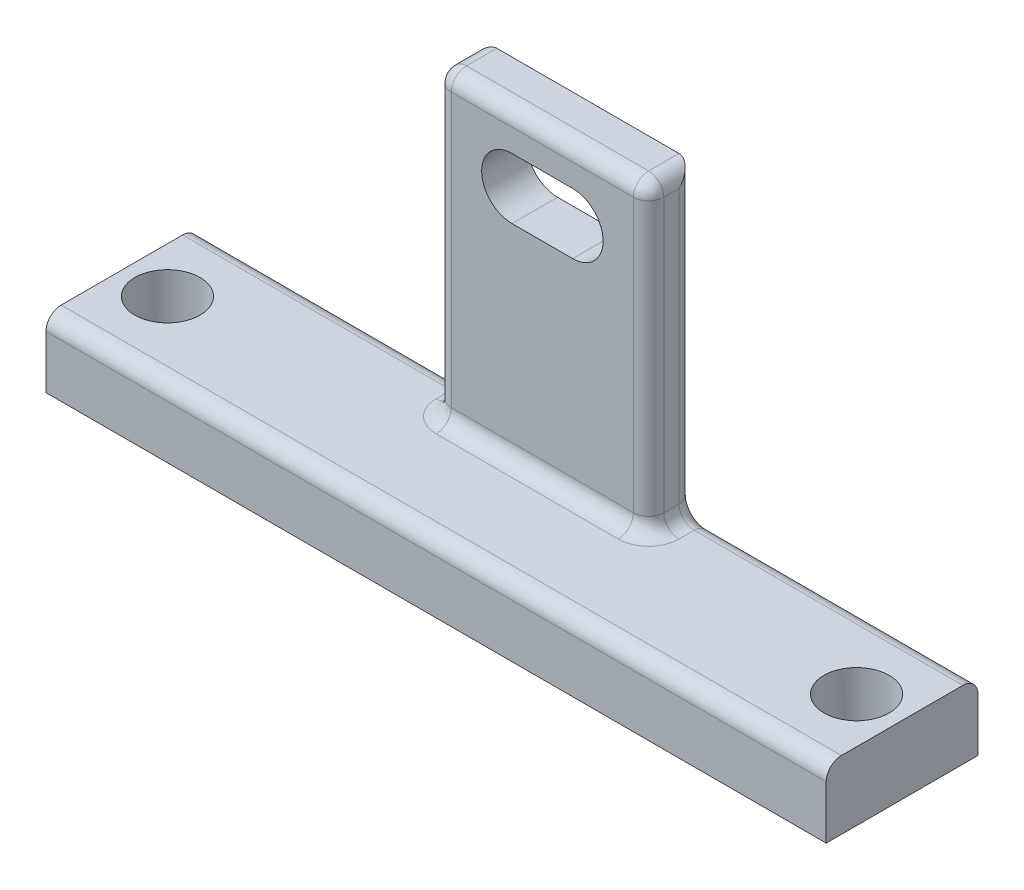
ISO-10303-21;
HEADER;
FILE_DESCRIPTION(('STEP AP214'),'2;1');
FILE_NAME('part.step','',(''),(''),'','','');
FILE_SCHEMA(('AUTOMOTIVE_DESIGN { 1 0 10303 214 1 1 1 1 }'));
ENDSEC;
DATA;
#1=APPLICATION_CONTEXT('core data for automotive mechanical design processes');
#2=APPLICATION_PROTOCOL_DEFINITION('international standard','automotive_design',2000,#1);
#3=PRODUCT_CONTEXT('',#1,'mechanical');
#4=PRODUCT('Part','Part','',(#3));
#5=PRODUCT_RELATED_PRODUCT_CATEGORY('part','',(#4));
#6=PRODUCT_DEFINITION_FORMATION('','',#4);
#7=PRODUCT_DEFINITION_CONTEXT('part definition',#1,'design');
#8=PRODUCT_DEFINITION('design','',#6,#7);
#9=PRODUCT_DEFINITION_SHAPE('','',#8);
#10=(LENGTH_UNIT() NAMED_UNIT(*) SI_UNIT(.MILLI.,.METRE.));
#11=(NAMED_UNIT(*) PLANE_ANGLE_UNIT() SI_UNIT($,.RADIAN.));
#12=(NAMED_UNIT(*) SI_UNIT($,.STERADIAN.) SOLID_ANGLE_UNIT());
#13=UNCERTAINTY_MEASURE_WITH_UNIT(LENGTH_MEASURE(1.E-05),#10,'distance_accuracy_value','');
#14=(GEOMETRIC_REPRESENTATION_CONTEXT(3) GLOBAL_UNCERTAINTY_ASSIGNED_CONTEXT((#13)) GLOBAL_UNIT_ASSIGNED_CONTEXT((#10,
#11,#12)) REPRESENTATION_CONTEXT('',''));
#15=CARTESIAN_POINT('',(0.,0.,0.));
#16=DIRECTION('',(0.,0.,1.));
#17=DIRECTION('',(1.,0.,0.));
#18=AXIS2_PLACEMENT_3D('',#15,#16,#17);
#19=CARTESIAN_POINT('',(-6.48837209302326,3.6453488372093,10.));
#20=DIRECTION('',(0.,-1.,0.));
#21=DIRECTION('',(0.,0.,-1.));
#22=AXIS2_PLACEMENT_3D('',#19,#20,#21);
#23=PLANE('',#22);
#24=CARTESIAN_POINT('',(41.9116279069767,3.6453488372093,5.));
#25=DIRECTION('',(0.,-1.,0.));
#26=DIRECTION('',(0.,0.,-1.));
#27=AXIS2_PLACEMENT_3D('',#24,#25,#26);
#28=CIRCLE('',#27,2.15);
#29=CARTESIAN_POINT('',(41.9116279069767,3.6453488372093,2.85));
#30=VERTEX_POINT('',#29);
#31=EDGE_CURVE('E272',#30,#30,#28,.T.);
#32=ORIENTED_EDGE('',*,*,#31,.T.);
#33=EDGE_LOOP('',(#32));
#34=FACE_BOUND('',#33,.T.);
#35=CARTESIAN_POINT('',(-3.48837209302326,3.6453488372093,5.));
#36=DIRECTION('',(0.,-1.,0.));
#37=DIRECTION('',(0.,0.,-1.));
#38=AXIS2_PLACEMENT_3D('',#35,#36,#37);
#39=CIRCLE('',#38,2.15);
#40=CARTESIAN_POINT('',(-3.48837209302326,3.6453488372093,2.85));
#41=VERTEX_POINT('',#40);
#42=EDGE_CURVE('E291',#41,#41,#39,.T.);
#43=ORIENTED_EDGE('',*,*,#42,.T.);
#44=EDGE_LOOP('',(#43));
#45=FACE_BOUND('',#44,.T.);
#46=DIRECTION('',(0.,0.,1.));
#47=VECTOR('',#46,1.);
#48=CARTESIAN_POINT('',(11.2116279069767,3.6453488372093,0.));
#49=LINE('',#48,#47);
#50=CARTESIAN_POINT('',(11.2116279069767,3.6453488372093,2.));
#51=VERTEX_POINT('',#50);
#52=CARTESIAN_POINT('',(11.2116279069767,3.6453488372093,0.999999999999999));
#53=VERTEX_POINT('',#52);
#54=EDGE_CURVE('E372',#51,#53,#49,.F.);
#55=ORIENTED_EDGE('',*,*,#54,.T.);
#56=DIRECTION('',(-1.,0.,0.));
#57=VECTOR('',#56,1.);
#58=CARTESIAN_POINT('',(-6.48837209302326,3.6453488372093,0.999999999999999));
#59=LINE('',#58,#57);
#60=CARTESIAN_POINT('',(-6.48837209302326,3.6453488372093,0.999999999999999));
#61=VERTEX_POINT('',#60);
#62=EDGE_CURVE('E375',#53,#61,#59,.T.);
#63=ORIENTED_EDGE('',*,*,#62,.T.);
#64=DIRECTION('',(0.,0.,-1.));
#65=VECTOR('',#64,1.);
#66=CARTESIAN_POINT('',(-6.48837209302326,3.6453488372093,10.));
#67=LINE('',#66,#65);
#68=CARTESIAN_POINT('',(-6.48837209302326,3.6453488372093,9.));
#69=VERTEX_POINT('',#68);
#70=EDGE_CURVE('E286',#69,#61,#67,.T.);
#71=ORIENTED_EDGE('',*,*,#70,.F.);
#72=DIRECTION('',(-1.,0.,0.));
#73=VECTOR('',#72,1.);
#74=CARTESIAN_POINT('',(44.9116279069767,3.6453488372093,9.));
#75=LINE('',#74,#73);
#76=CARTESIAN_POINT('',(44.9116279069767,3.6453488372093,9.));
#77=VERTEX_POINT('',#76);
#78=EDGE_CURVE('E352',#69,#77,#75,.F.);
#79=ORIENTED_EDGE('',*,*,#78,.T.);
#80=DIRECTION('',(0.,0.,-1.));
#81=VECTOR('',#80,1.);
#82=CARTESIAN_POINT('',(44.9116279069767,3.6453488372093,10.));
#83=LINE('',#82,#81);
#84=CARTESIAN_POINT('',(44.9116279069767,3.6453488372093,0.999999999999999));
#85=VERTEX_POINT('',#84);
#86=EDGE_CURVE('E300',#77,#85,#83,.T.);
#87=ORIENTED_EDGE('',*,*,#86,.T.);
#88=DIRECTION('',(-1.,0.,0.));
#89=VECTOR('',#88,1.);
#90=CARTESIAN_POINT('',(-6.48837209302326,3.6453488372093,0.999999999999999));
#91=LINE('',#90,#89);
#92=CARTESIAN_POINT('',(27.2116279069767,3.6453488372093,0.999999999999999));
#93=VERTEX_POINT('',#92);
#94=EDGE_CURVE('E355',#85,#93,#91,.T.);
#95=ORIENTED_EDGE('',*,*,#94,.T.);
#96=DIRECTION('',(0.,0.,-1.));
#97=VECTOR('',#96,1.);
#98=CARTESIAN_POINT('',(27.2116279069767,3.6453488372093,3.));
#99=LINE('',#98,#97);
#100=CARTESIAN_POINT('',(27.2116279069767,3.6453488372093,2.));
#101=VERTEX_POINT('',#100);
#102=EDGE_CURVE('E358',#93,#101,#99,.F.);
#103=ORIENTED_EDGE('',*,*,#102,.T.);
#104=CARTESIAN_POINT('',(25.2116279069767,3.6453488372093,2.));
#105=DIRECTION('',(0.,-1.,0.));
#106=DIRECTION('',(0.,0.,-1.));
#107=AXIS2_PLACEMENT_3D('',#104,#105,#106);
#108=CIRCLE('',#107,2.);
#109=CARTESIAN_POINT('',(25.2116279069767,3.6453488372093,4.));
#110=VERTEX_POINT('',#109);
#111=EDGE_CURVE('E361',#110,#101,#108,.F.);
#112=ORIENTED_EDGE('',*,*,#111,.F.);
#113=DIRECTION('',(1.,0.,0.));
#114=VECTOR('',#113,1.);
#115=CARTESIAN_POINT('',(12.2116279069767,3.6453488372093,4.));
#116=LINE('',#115,#114);
#117=CARTESIAN_POINT('',(13.2116279069767,3.6453488372093,4.));
#118=VERTEX_POINT('',#117);
#119=EDGE_CURVE('E365',#110,#118,#116,.F.);
#120=ORIENTED_EDGE('',*,*,#119,.T.);
#121=CARTESIAN_POINT('',(13.2116279069767,3.6453488372093,2.));
#122=DIRECTION('',(0.,-1.,0.));
#123=DIRECTION('',(0.,0.,-1.));
#124=AXIS2_PLACEMENT_3D('',#121,#122,#123);
#125=CIRCLE('',#124,2.);
#126=EDGE_CURVE('E368',#51,#118,#125,.F.);
#127=ORIENTED_EDGE('',*,*,#126,.F.);
#128=EDGE_LOOP('',(#55,#63,#71,#79,#87,#95,#103,#112,#120,#127));
#129=FACE_BOUND('',#128,.T.);
#130=ADVANCED_FACE('F49',(#34,#45,#129),#23,.F.);
#131=CARTESIAN_POINT('',(-6.48837209302326,3.6453488372093,10.));
#132=DIRECTION('',(1.,0.,0.));
#133=DIRECTION('',(0.,1.,0.));
#134=AXIS2_PLACEMENT_3D('',#131,#132,#133);
#135=PLANE('',#134);
#136=ORIENTED_EDGE('',*,*,#70,.T.);
#137=CARTESIAN_POINT('',(-6.48837209302326,2.6453488372093,0.999999999999999));
#138=DIRECTION('',(1.,0.,0.));
#139=DIRECTION('',(0.,1.,0.));
#140=AXIS2_PLACEMENT_3D('',#137,#138,#139);
#141=CIRCLE('',#140,1.);
#142=CARTESIAN_POINT('',(-6.48837209302326,2.6453488372093,0.));
#143=VERTEX_POINT('',#142);
#144=EDGE_CURVE('E381',#61,#143,#141,.F.);
#145=ORIENTED_EDGE('',*,*,#144,.T.);
#146=DIRECTION('',(0.,-1.,0.));
#147=VECTOR('',#146,1.);
#148=CARTESIAN_POINT('',(-6.48837209302326,3.6453488372093,0.));
#149=LINE('',#148,#147);
#150=CARTESIAN_POINT('',(-6.48837209302326,-0.854651162790699,0.));
#151=VERTEX_POINT('',#150);
#152=EDGE_CURVE('E287',#143,#151,#149,.T.);
#153=ORIENTED_EDGE('',*,*,#152,.T.);
#154=DIRECTION('',(0.,0.,-1.));
#155=VECTOR('',#154,1.);
#156=CARTESIAN_POINT('',(-6.48837209302326,-0.854651162790699,10.));
#157=LINE('',#156,#155);
#158=CARTESIAN_POINT('',(-6.48837209302326,-0.854651162790699,10.));
#159=VERTEX_POINT('',#158);
#160=EDGE_CURVE('E308',#159,#151,#157,.T.);
#161=ORIENTED_EDGE('',*,*,#160,.F.);
#162=DIRECTION('',(0.,-1.,0.));
#163=VECTOR('',#162,1.);
#164=CARTESIAN_POINT('',(-6.48837209302326,3.6453488372093,10.));
#165=LINE('',#164,#163);
#166=CARTESIAN_POINT('',(-6.48837209302326,2.6453488372093,10.));
#167=VERTEX_POINT('',#166);
#168=EDGE_CURVE('E276',#167,#159,#165,.T.);
#169=ORIENTED_EDGE('',*,*,#168,.F.);
#170=CARTESIAN_POINT('',(-6.48837209302326,2.6453488372093,9.));
#171=DIRECTION('',(1.,0.,0.));
#172=DIRECTION('',(0.,1.,0.));
#173=AXIS2_PLACEMENT_3D('',#170,#171,#172);
#174=CIRCLE('',#173,1.);
#175=EDGE_CURVE('E378',#167,#69,#174,.F.);
#176=ORIENTED_EDGE('',*,*,#175,.T.);
#177=EDGE_LOOP('',(#136,#145,#153,#161,#169,#176));
#178=FACE_BOUND('',#177,.T.);
#179=ADVANCED_FACE('F610',(#178),#135,.F.);
#180=CARTESIAN_POINT('',(-6.48837209302326,-0.854651162790699,10.));
#181=DIRECTION('',(0.,1.,0.));
#182=DIRECTION('',(0.,0.,1.));
#183=AXIS2_PLACEMENT_3D('',#180,#181,#182);
#184=PLANE('',#183);
#185=CARTESIAN_POINT('',(-3.48837209302326,-0.854651162790699,5.));
#186=DIRECTION('',(0.,1.,0.));
#187=DIRECTION('',(0.,0.,1.));
#188=AXIS2_PLACEMENT_3D('',#185,#186,#187);
#189=CIRCLE('',#188,2.15);
#190=CARTESIAN_POINT('',(-3.48837209302326,-0.854651162790699,7.15));
#191=VERTEX_POINT('',#190);
#192=EDGE_CURVE('E268',#191,#191,#189,.T.);
#193=ORIENTED_EDGE('',*,*,#192,.T.);
#194=EDGE_LOOP('',(#193));
#195=FACE_BOUND('',#194,.T.);
#196=CARTESIAN_POINT('',(41.9116279069767,-0.854651162790699,5.));
#197=DIRECTION('',(0.,1.,0.));
#198=DIRECTION('',(0.,0.,1.));
#199=AXIS2_PLACEMENT_3D('',#196,#197,#198);
#200=CIRCLE('',#199,2.15);
#201=CARTESIAN_POINT('',(41.9116279069767,-0.854651162790699,7.15));
#202=VERTEX_POINT('',#201);
#203=EDGE_CURVE('E267',#202,#202,#200,.T.);
#204=ORIENTED_EDGE('',*,*,#203,.T.);
#205=EDGE_LOOP('',(#204));
#206=FACE_BOUND('',#205,.T.);
#207=DIRECTION('',(1.,0.,0.));
#208=VECTOR('',#207,1.);
#209=CARTESIAN_POINT('',(-6.48837209302326,-0.854651162790699,0.));
#210=LINE('',#209,#208);
#211=CARTESIAN_POINT('',(44.9116279069767,-0.854651162790699,0.));
#212=VERTEX_POINT('',#211);
#213=EDGE_CURVE('E290',#151,#212,#210,.T.);
#214=ORIENTED_EDGE('',*,*,#213,.T.);
#215=DIRECTION('',(0.,0.,-1.));
#216=VECTOR('',#215,1.);
#217=CARTESIAN_POINT('',(44.9116279069767,-0.854651162790699,10.));
#218=LINE('',#217,#216);
#219=CARTESIAN_POINT('',(44.9116279069767,-0.854651162790699,10.));
#220=VERTEX_POINT('',#219);
#221=EDGE_CURVE('E304',#220,#212,#218,.T.);
#222=ORIENTED_EDGE('',*,*,#221,.F.);
#223=DIRECTION('',(1.,0.,0.));
#224=VECTOR('',#223,1.);
#225=CARTESIAN_POINT('',(-6.48837209302326,-0.854651162790699,10.));
#226=LINE('',#225,#224);
#227=EDGE_CURVE('E279',#159,#220,#226,.T.);
#228=ORIENTED_EDGE('',*,*,#227,.F.);
#229=ORIENTED_EDGE('',*,*,#160,.T.);
#230=EDGE_LOOP('',(#214,#222,#228,#229));
#231=FACE_BOUND('',#230,.T.);
#232=ADVANCED_FACE('F617',(#195,#206,#231),#184,.F.);
#233=CARTESIAN_POINT('',(44.9116279069767,3.6453488372093,10.));
#234=DIRECTION('',(-1.,0.,0.));
#235=DIRECTION('',(0.,0.,1.));
#236=AXIS2_PLACEMENT_3D('',#233,#234,#235);
#237=PLANE('',#236);
#238=DIRECTION('',(0.,1.,0.));
#239=VECTOR('',#238,1.);
#240=CARTESIAN_POINT('',(44.9116279069767,3.6453488372093,0.));
#241=LINE('',#240,#239);
#242=CARTESIAN_POINT('',(44.9116279069767,2.6453488372093,0.));
#243=VERTEX_POINT('',#242);
#244=EDGE_CURVE('E280',#212,#243,#241,.T.);
#245=ORIENTED_EDGE('',*,*,#244,.T.);
#246=CARTESIAN_POINT('',(44.9116279069767,2.6453488372093,0.999999999999999));
#247=DIRECTION('',(-1.,0.,0.));
#248=DIRECTION('',(0.,0.,1.));
#249=AXIS2_PLACEMENT_3D('',#246,#247,#248);
#250=CIRCLE('',#249,1.);
#251=EDGE_CURVE('E59',#243,#85,#250,.F.);
#252=ORIENTED_EDGE('',*,*,#251,.T.);
#253=ORIENTED_EDGE('',*,*,#86,.F.);
#254=CARTESIAN_POINT('',(44.9116279069767,2.6453488372093,9.));
#255=DIRECTION('',(-1.,0.,0.));
#256=DIRECTION('',(0.,0.,1.));
#257=AXIS2_PLACEMENT_3D('',#254,#255,#256);
#258=CIRCLE('',#257,1.);
#259=CARTESIAN_POINT('',(44.9116279069767,2.6453488372093,10.));
#260=VERTEX_POINT('',#259);
#261=EDGE_CURVE('E67',#77,#260,#258,.F.);
#262=ORIENTED_EDGE('',*,*,#261,.T.);
#263=DIRECTION('',(0.,1.,0.));
#264=VECTOR('',#263,1.);
#265=CARTESIAN_POINT('',(44.9116279069767,3.6453488372093,10.));
#266=LINE('',#265,#264);
#267=EDGE_CURVE('E283',#220,#260,#266,.T.);
#268=ORIENTED_EDGE('',*,*,#267,.F.);
#269=ORIENTED_EDGE('',*,*,#221,.T.);
#270=EDGE_LOOP('',(#245,#252,#253,#262,#268,#269));
#271=FACE_BOUND('',#270,.T.);
#272=ADVANCED_FACE('F622',(#271),#237,.F.);
#273=CARTESIAN_POINT('',(0.,0.,10.));
#274=DIRECTION('',(0.,0.,1.));
#275=DIRECTION('',(1.,0.,0.));
#276=AXIS2_PLACEMENT_3D('',#273,#274,#275);
#277=PLANE('',#276);
#278=ORIENTED_EDGE('',*,*,#267,.T.);
#279=DIRECTION('',(-1.,0.,0.));
#280=VECTOR('',#279,1.);
#281=CARTESIAN_POINT('',(-6.48837209302326,2.6453488372093,10.));
#282=LINE('',#281,#280);
#283=EDGE_CURVE('E11',#260,#167,#282,.T.);
#284=ORIENTED_EDGE('',*,*,#283,.T.);
#285=ORIENTED_EDGE('',*,*,#168,.T.);
#286=ORIENTED_EDGE('',*,*,#227,.T.);
#287=EDGE_LOOP('',(#278,#284,#285,#286));
#288=FACE_BOUND('',#287,.T.);
#289=ADVANCED_FACE('F513',(#288),#277,.T.);
#290=CARTESIAN_POINT('',(0.,0.,0.));
#291=DIRECTION('',(0.,0.,1.));
#292=DIRECTION('',(1.,0.,0.));
#293=AXIS2_PLACEMENT_3D('',#290,#291,#292);
#294=PLANE('',#293);
#295=DIRECTION('',(-1.,0.,0.));
#296=VECTOR('',#295,1.);
#297=CARTESIAN_POINT('',(0.,21.1453488372093,0.));
#298=LINE('',#297,#296);
#299=CARTESIAN_POINT('',(21.2116279069767,21.1453488372093,0.));
#300=VERTEX_POINT('',#299);
#301=CARTESIAN_POINT('',(17.2116279069767,21.1453488372093,0.));
#302=VERTEX_POINT('',#301);
#303=EDGE_CURVE('E256',#300,#302,#298,.T.);
#304=ORIENTED_EDGE('',*,*,#303,.T.);
#305=CARTESIAN_POINT('',(17.2116279069767,19.1453488372093,0.));
#306=DIRECTION('',(0.,0.,1.));
#307=DIRECTION('',(1.,0.,0.));
#308=AXIS2_PLACEMENT_3D('',#305,#306,#307);
#309=CIRCLE('',#308,2.);
#310=CARTESIAN_POINT('',(17.2116279069767,17.1453488372093,0.));
#311=VERTEX_POINT('',#310);
#312=EDGE_CURVE('E260',#302,#311,#309,.T.);
#313=ORIENTED_EDGE('',*,*,#312,.T.);
#314=DIRECTION('',(1.,0.,0.));
#315=VECTOR('',#314,1.);
#316=CARTESIAN_POINT('',(0.,17.1453488372093,0.));
#317=LINE('',#316,#315);
#318=CARTESIAN_POINT('',(21.2116279069767,17.1453488372093,0.));
#319=VERTEX_POINT('',#318);
#320=EDGE_CURVE('E247',#311,#319,#317,.T.);
#321=ORIENTED_EDGE('',*,*,#320,.T.);
#322=CARTESIAN_POINT('',(21.2116279069767,19.1453488372093,0.));
#323=DIRECTION('',(0.,0.,1.));
#324=DIRECTION('',(1.,0.,0.));
#325=AXIS2_PLACEMENT_3D('',#322,#323,#324);
#326=CIRCLE('',#325,1.99999999999999);
#327=EDGE_CURVE('E218',#319,#300,#326,.T.);
#328=ORIENTED_EDGE('',*,*,#327,.T.);
#329=EDGE_LOOP('',(#304,#313,#321,#328));
#330=FACE_BOUND('',#329,.T.);
#331=ORIENTED_EDGE('',*,*,#152,.F.);
#332=DIRECTION('',(-1.,0.,0.));
#333=VECTOR('',#332,1.);
#334=CARTESIAN_POINT('',(0.,2.6453488372093,0.));
#335=LINE('',#334,#333);
#336=CARTESIAN_POINT('',(11.2116279069767,2.6453488372093,0.));
#337=VERTEX_POINT('',#336);
#338=EDGE_CURVE('E336',#143,#337,#335,.F.);
#339=ORIENTED_EDGE('',*,*,#338,.T.);
#340=CARTESIAN_POINT('',(11.2116279069767,4.6453488372093,0.));
#341=DIRECTION('',(0.,0.,1.));
#342=DIRECTION('',(1.,0.,0.));
#343=AXIS2_PLACEMENT_3D('',#340,#341,#342);
#344=CIRCLE('',#343,2.);
#345=CARTESIAN_POINT('',(13.2116279069767,4.6453488372093,0.));
#346=VERTEX_POINT('',#345);
#347=EDGE_CURVE('E332',#346,#337,#344,.F.);
#348=ORIENTED_EDGE('',*,*,#347,.F.);
#349=DIRECTION('',(0.,-1.,0.));
#350=VECTOR('',#349,1.);
#351=CARTESIAN_POINT('',(13.2116279069767,0.,0.));
#352=LINE('',#351,#350);
#353=CARTESIAN_POINT('',(13.2116279069767,23.6453488372093,0.));
#354=VERTEX_POINT('',#353);
#355=EDGE_CURVE('E329',#346,#354,#352,.F.);
#356=ORIENTED_EDGE('',*,*,#355,.T.);
#357=DIRECTION('',(-1.,0.,0.));
#358=VECTOR('',#357,1.);
#359=CARTESIAN_POINT('',(12.2116279069767,23.6453488372093,0.));
#360=LINE('',#359,#358);
#361=CARTESIAN_POINT('',(25.2116279069767,23.6453488372093,0.));
#362=VERTEX_POINT('',#361);
#363=EDGE_CURVE('E264',#362,#354,#360,.T.);
#364=ORIENTED_EDGE('',*,*,#363,.F.);
#365=DIRECTION('',(0.,-1.,0.));
#366=VECTOR('',#365,1.);
#367=CARTESIAN_POINT('',(25.2116279069767,0.,0.));
#368=LINE('',#367,#366);
#369=CARTESIAN_POINT('',(25.2116279069767,4.6453488372093,0.));
#370=VERTEX_POINT('',#369);
#371=EDGE_CURVE('E325',#362,#370,#368,.T.);
#372=ORIENTED_EDGE('',*,*,#371,.T.);
#373=CARTESIAN_POINT('',(27.2116279069767,4.6453488372093,0.));
#374=DIRECTION('',(0.,0.,1.));
#375=DIRECTION('',(1.,0.,0.));
#376=AXIS2_PLACEMENT_3D('',#373,#374,#375);
#377=CIRCLE('',#376,2.);
#378=CARTESIAN_POINT('',(27.2116279069767,2.6453488372093,0.));
#379=VERTEX_POINT('',#378);
#380=EDGE_CURVE('E321',#379,#370,#377,.F.);
#381=ORIENTED_EDGE('',*,*,#380,.F.);
#382=DIRECTION('',(-1.,0.,0.));
#383=VECTOR('',#382,1.);
#384=CARTESIAN_POINT('',(0.,2.6453488372093,0.));
#385=LINE('',#384,#383);
#386=EDGE_CURVE('E312',#379,#243,#385,.F.);
#387=ORIENTED_EDGE('',*,*,#386,.T.);
#388=ORIENTED_EDGE('',*,*,#244,.F.);
#389=ORIENTED_EDGE('',*,*,#213,.F.);
#390=EDGE_LOOP('',(#331,#339,#348,#356,#364,#372,#381,#387,#388,#389));
#391=FACE_BOUND('',#390,.T.);
#392=ADVANCED_FACE('F509',(#330,#391),#294,.F.);
#393=CARTESIAN_POINT('',(41.9116279069767,-0.854651162790699,5.));
#394=DIRECTION('',(0.,1.,0.));
#395=DIRECTION('',(0.,0.,1.));
#396=AXIS2_PLACEMENT_3D('',#393,#394,#395);
#397=CYLINDRICAL_SURFACE('',#396,2.15);
#398=ORIENTED_EDGE('',*,*,#203,.F.);
#399=EDGE_LOOP('',(#398));
#400=FACE_BOUND('',#399,.T.);
#401=ORIENTED_EDGE('',*,*,#31,.F.);
#402=EDGE_LOOP('',(#401));
#403=FACE_BOUND('',#402,.T.);
#404=ADVANCED_FACE('F512',(#400,#403),#397,.F.);
#405=CARTESIAN_POINT('',(-3.48837209302326,-0.854651162790699,5.));
#406=DIRECTION('',(0.,1.,0.));
#407=DIRECTION('',(0.,0.,1.));
#408=AXIS2_PLACEMENT_3D('',#405,#406,#407);
#409=CYLINDRICAL_SURFACE('',#408,2.15);
#410=ORIENTED_EDGE('',*,*,#192,.F.);
#411=EDGE_LOOP('',(#410));
#412=FACE_BOUND('',#411,.T.);
#413=ORIENTED_EDGE('',*,*,#42,.F.);
#414=EDGE_LOOP('',(#413));
#415=FACE_BOUND('',#414,.T.);
#416=ADVANCED_FACE('F607',(#412,#415),#409,.F.);
#417=CARTESIAN_POINT('',(12.2116279069767,23.6453488372093,0.));
#418=DIRECTION('',(1.,0.,0.));
#419=DIRECTION('',(0.,0.,-1.));
#420=AXIS2_PLACEMENT_3D('',#417,#418,#419);
#421=PLANE('',#420);
#422=DIRECTION('',(0.,0.,1.));
#423=VECTOR('',#422,1.);
#424=CARTESIAN_POINT('',(12.2116279069767,22.6453488372093,0.));
#425=LINE('',#424,#423);
#426=CARTESIAN_POINT('',(12.2116279069767,22.6453488372093,2.));
#427=VERTEX_POINT('',#426);
#428=CARTESIAN_POINT('',(12.2116279069767,22.6453488372093,1.));
#429=VERTEX_POINT('',#428);
#430=EDGE_CURVE('E403',#427,#429,#425,.F.);
#431=ORIENTED_EDGE('',*,*,#430,.T.);
#432=DIRECTION('',(0.,-1.,0.));
#433=VECTOR('',#432,1.);
#434=CARTESIAN_POINT('',(12.2116279069767,23.6453488372093,1.));
#435=LINE('',#434,#433);
#436=CARTESIAN_POINT('',(12.2116279069767,4.6453488372093,1.));
#437=VERTEX_POINT('',#436);
#438=EDGE_CURVE('E406',#429,#437,#435,.T.);
#439=ORIENTED_EDGE('',*,*,#438,.T.);
#440=DIRECTION('',(0.,0.,1.));
#441=VECTOR('',#440,1.);
#442=CARTESIAN_POINT('',(12.2116279069767,4.6453488372093,3.));
#443=LINE('',#442,#441);
#444=CARTESIAN_POINT('',(12.2116279069767,4.6453488372093,2.));
#445=VERTEX_POINT('',#444);
#446=EDGE_CURVE('E397',#437,#445,#443,.T.);
#447=ORIENTED_EDGE('',*,*,#446,.T.);
#448=DIRECTION('',(0.,-1.,0.));
#449=VECTOR('',#448,1.);
#450=CARTESIAN_POINT('',(12.2116279069767,23.6453488372093,2.));
#451=LINE('',#450,#449);
#452=EDGE_CURVE('E400',#445,#427,#451,.F.);
#453=ORIENTED_EDGE('',*,*,#452,.T.);
#454=EDGE_LOOP('',(#431,#439,#447,#453));
#455=FACE_BOUND('',#454,.T.);
#456=ADVANCED_FACE('F595',(#455),#421,.F.);
#457=CARTESIAN_POINT('',(12.2116279069767,23.6453488372093,3.));
#458=DIRECTION('',(0.,0.,-1.));
#459=DIRECTION('',(-1.,0.,0.));
#460=AXIS2_PLACEMENT_3D('',#457,#458,#459);
#461=PLANE('',#460);
#462=DIRECTION('',(0.,-1.,0.));
#463=VECTOR('',#462,1.);
#464=CARTESIAN_POINT('',(13.2116279069767,23.6453488372093,3.));
#465=LINE('',#464,#463);
#466=CARTESIAN_POINT('',(13.2116279069767,22.6453488372093,3.));
#467=VERTEX_POINT('',#466);
#468=CARTESIAN_POINT('',(13.2116279069767,4.6453488372093,3.));
#469=VERTEX_POINT('',#468);
#470=EDGE_CURVE('E390',#467,#469,#465,.T.);
#471=ORIENTED_EDGE('',*,*,#470,.T.);
#472=DIRECTION('',(1.,0.,0.));
#473=VECTOR('',#472,1.);
#474=CARTESIAN_POINT('',(26.2116279069767,4.6453488372093,3.));
#475=LINE('',#474,#473);
#476=CARTESIAN_POINT('',(25.2116279069767,4.6453488372093,3.));
#477=VERTEX_POINT('',#476);
#478=EDGE_CURVE('E393',#469,#477,#475,.T.);
#479=ORIENTED_EDGE('',*,*,#478,.T.);
#480=DIRECTION('',(0.,-1.,0.));
#481=VECTOR('',#480,1.);
#482=CARTESIAN_POINT('',(25.2116279069767,23.6453488372093,3.));
#483=LINE('',#482,#481);
#484=CARTESIAN_POINT('',(25.2116279069767,22.6453488372093,3.));
#485=VERTEX_POINT('',#484);
#486=EDGE_CURVE('E384',#477,#485,#483,.F.);
#487=ORIENTED_EDGE('',*,*,#486,.T.);
#488=DIRECTION('',(1.,0.,0.));
#489=VECTOR('',#488,1.);
#490=CARTESIAN_POINT('',(12.2116279069767,22.6453488372093,3.));
#491=LINE('',#490,#489);
#492=EDGE_CURVE('E387',#485,#467,#491,.F.);
#493=ORIENTED_EDGE('',*,*,#492,.T.);
#494=EDGE_LOOP('',(#471,#479,#487,#493));
#495=FACE_BOUND('',#494,.T.);
#496=DIRECTION('',(1.,0.,0.));
#497=VECTOR('',#496,1.);
#498=CARTESIAN_POINT('',(17.2116279069767,17.1453488372093,3.));
#499=LINE('',#498,#497);
#500=CARTESIAN_POINT('',(17.2116279069767,17.1453488372093,3.));
#501=VERTEX_POINT('',#500);
#502=CARTESIAN_POINT('',(21.2116279069767,17.1453488372093,3.));
#503=VERTEX_POINT('',#502);
#504=EDGE_CURVE('E227',#501,#503,#499,.T.);
#505=ORIENTED_EDGE('',*,*,#504,.F.);
#506=CARTESIAN_POINT('',(17.2116279069767,19.1453488372093,3.));
#507=DIRECTION('',(0.,0.,1.));
#508=DIRECTION('',(-1.,0.,0.));
#509=AXIS2_PLACEMENT_3D('',#506,#507,#508);
#510=CIRCLE('',#509,2.);
#511=CARTESIAN_POINT('',(17.2116279069767,21.1453488372093,3.));
#512=VERTEX_POINT('',#511);
#513=EDGE_CURVE('E233',#512,#501,#510,.T.);
#514=ORIENTED_EDGE('',*,*,#513,.F.);
#515=DIRECTION('',(-1.,0.,0.));
#516=VECTOR('',#515,1.);
#517=CARTESIAN_POINT('',(17.2116279069767,21.1453488372093,3.));
#518=LINE('',#517,#516);
#519=CARTESIAN_POINT('',(21.2116279069767,21.1453488372093,3.));
#520=VERTEX_POINT('',#519);
#521=EDGE_CURVE('E237',#520,#512,#518,.T.);
#522=ORIENTED_EDGE('',*,*,#521,.F.);
#523=CARTESIAN_POINT('',(21.2116279069767,19.1453488372093,3.));
#524=DIRECTION('',(0.,0.,1.));
#525=DIRECTION('',(-1.,0.,0.));
#526=AXIS2_PLACEMENT_3D('',#523,#524,#525);
#527=CIRCLE('',#526,1.99999999999999);
#528=EDGE_CURVE('E215',#503,#520,#527,.T.);
#529=ORIENTED_EDGE('',*,*,#528,.F.);
#530=EDGE_LOOP('',(#505,#514,#522,#529));
#531=FACE_BOUND('',#530,.T.);
#532=ADVANCED_FACE('F235',(#495,#531),#461,.F.);
#533=CARTESIAN_POINT('',(26.2116279069767,23.6453488372093,0.));
#534=DIRECTION('',(-1.,0.,0.));
#535=DIRECTION('',(0.,0.,1.));
#536=AXIS2_PLACEMENT_3D('',#533,#534,#535);
#537=PLANE('',#536);
#538=DIRECTION('',(0.,0.,-1.));
#539=VECTOR('',#538,1.);
#540=CARTESIAN_POINT('',(26.2116279069767,4.6453488372093,0.));
#541=LINE('',#540,#539);
#542=CARTESIAN_POINT('',(26.2116279069767,4.6453488372093,2.));
#543=VERTEX_POINT('',#542);
#544=CARTESIAN_POINT('',(26.2116279069767,4.6453488372093,1.));
#545=VERTEX_POINT('',#544);
#546=EDGE_CURVE('E345',#543,#545,#541,.T.);
#547=ORIENTED_EDGE('',*,*,#546,.T.);
#548=DIRECTION('',(0.,-1.,0.));
#549=VECTOR('',#548,1.);
#550=CARTESIAN_POINT('',(26.2116279069767,23.6453488372093,1.));
#551=LINE('',#550,#549);
#552=CARTESIAN_POINT('',(26.2116279069767,22.6453488372093,1.));
#553=VERTEX_POINT('',#552);
#554=EDGE_CURVE('E348',#545,#553,#551,.F.);
#555=ORIENTED_EDGE('',*,*,#554,.T.);
#556=DIRECTION('',(0.,0.,-1.));
#557=VECTOR('',#556,1.);
#558=CARTESIAN_POINT('',(26.2116279069767,22.6453488372093,3.));
#559=LINE('',#558,#557);
#560=CARTESIAN_POINT('',(26.2116279069767,22.6453488372093,2.));
#561=VERTEX_POINT('',#560);
#562=EDGE_CURVE('E339',#553,#561,#559,.F.);
#563=ORIENTED_EDGE('',*,*,#562,.T.);
#564=DIRECTION('',(0.,-1.,0.));
#565=VECTOR('',#564,1.);
#566=CARTESIAN_POINT('',(26.2116279069767,23.6453488372093,2.));
#567=LINE('',#566,#565);
#568=EDGE_CURVE('E342',#561,#543,#567,.T.);
#569=ORIENTED_EDGE('',*,*,#568,.T.);
#570=EDGE_LOOP('',(#547,#555,#563,#569));
#571=FACE_BOUND('',#570,.T.);
#572=ADVANCED_FACE('F570',(#571),#537,.F.);
#573=CARTESIAN_POINT('',(0.,23.6453488372093,0.));
#574=DIRECTION('',(0.,1.,0.));
#575=DIRECTION('',(0.,0.,1.));
#576=AXIS2_PLACEMENT_3D('',#573,#574,#575);
#577=PLANE('',#576);
#578=ORIENTED_EDGE('',*,*,#363,.T.);
#579=DIRECTION('',(0.,0.,1.));
#580=VECTOR('',#579,1.);
#581=CARTESIAN_POINT('',(13.2116279069767,23.6453488372093,3.));
#582=LINE('',#581,#580);
#583=CARTESIAN_POINT('',(13.2116279069767,23.6453488372093,2.));
#584=VERTEX_POINT('',#583);
#585=EDGE_CURVE('E75',#354,#584,#582,.T.);
#586=ORIENTED_EDGE('',*,*,#585,.T.);
#587=DIRECTION('',(1.,0.,0.));
#588=VECTOR('',#587,1.);
#589=CARTESIAN_POINT('',(26.2116279069767,23.6453488372093,2.));
#590=LINE('',#589,#588);
#591=CARTESIAN_POINT('',(25.2116279069767,23.6453488372093,2.));
#592=VERTEX_POINT('',#591);
#593=EDGE_CURVE('E413',#584,#592,#590,.T.);
#594=ORIENTED_EDGE('',*,*,#593,.T.);
#595=DIRECTION('',(0.,0.,-1.));
#596=VECTOR('',#595,1.);
#597=CARTESIAN_POINT('',(25.2116279069767,23.6453488372093,0.));
#598=LINE('',#597,#596);
#599=EDGE_CURVE('E410',#592,#362,#598,.T.);
#600=ORIENTED_EDGE('',*,*,#599,.T.);
#601=EDGE_LOOP('',(#578,#586,#594,#600));
#602=FACE_BOUND('',#601,.T.);
#603=ADVANCED_FACE('F529',(#602),#577,.T.);
#604=CARTESIAN_POINT('',(17.2116279069767,19.1453488372093,-17.));
#605=DIRECTION('',(0.,0.,1.));
#606=DIRECTION('',(1.,0.,0.));
#607=AXIS2_PLACEMENT_3D('',#604,#605,#606);
#608=CYLINDRICAL_SURFACE('',#607,2.);
#609=DIRECTION('',(0.,0.,1.));
#610=VECTOR('',#609,1.);
#611=CARTESIAN_POINT('',(17.2116279069767,21.1453488372093,-17.));
#612=LINE('',#611,#610);
#613=EDGE_CURVE('E244',#302,#512,#612,.T.);
#614=ORIENTED_EDGE('',*,*,#613,.T.);
#615=ORIENTED_EDGE('',*,*,#513,.T.);
#616=DIRECTION('',(0.,0.,1.));
#617=VECTOR('',#616,1.);
#618=CARTESIAN_POINT('',(17.2116279069767,17.1453488372093,-17.));
#619=LINE('',#618,#617);
#620=EDGE_CURVE('E223',#311,#501,#619,.T.);
#621=ORIENTED_EDGE('',*,*,#620,.F.);
#622=ORIENTED_EDGE('',*,*,#312,.F.);
#623=EDGE_LOOP('',(#614,#615,#621,#622));
#624=FACE_BOUND('',#623,.T.);
#625=ADVANCED_FACE('F504',(#624),#608,.F.);
#626=CARTESIAN_POINT('',(17.2116279069767,21.1453488372093,-17.));
#627=DIRECTION('',(0.,1.,0.));
#628=DIRECTION('',(-1.,0.,0.));
#629=AXIS2_PLACEMENT_3D('',#626,#627,#628);
#630=PLANE('',#629);
#631=DIRECTION('',(0.,0.,1.));
#632=VECTOR('',#631,1.);
#633=CARTESIAN_POINT('',(21.2116279069767,21.1453488372093,-17.));
#634=LINE('',#633,#632);
#635=EDGE_CURVE('E222',#300,#520,#634,.T.);
#636=ORIENTED_EDGE('',*,*,#635,.T.);
#637=ORIENTED_EDGE('',*,*,#521,.T.);
#638=ORIENTED_EDGE('',*,*,#613,.F.);
#639=ORIENTED_EDGE('',*,*,#303,.F.);
#640=EDGE_LOOP('',(#636,#637,#638,#639));
#641=FACE_BOUND('',#640,.T.);
#642=ADVANCED_FACE('F507',(#641),#630,.F.);
#643=CARTESIAN_POINT('',(21.2116279069767,19.1453488372093,-17.));
#644=DIRECTION('',(0.,0.,1.));
#645=DIRECTION('',(1.,0.,0.));
#646=AXIS2_PLACEMENT_3D('',#643,#644,#645);
#647=CYLINDRICAL_SURFACE('',#646,1.99999999999999);
#648=DIRECTION('',(0.,0.,1.));
#649=VECTOR('',#648,1.);
#650=CARTESIAN_POINT('',(21.2116279069767,17.1453488372093,-17.));
#651=LINE('',#650,#649);
#652=EDGE_CURVE('E210',#319,#503,#651,.T.);
#653=ORIENTED_EDGE('',*,*,#652,.T.);
#654=ORIENTED_EDGE('',*,*,#528,.T.);
#655=ORIENTED_EDGE('',*,*,#635,.F.);
#656=ORIENTED_EDGE('',*,*,#327,.F.);
#657=EDGE_LOOP('',(#653,#654,#655,#656));
#658=FACE_BOUND('',#657,.T.);
#659=ADVANCED_FACE('F212',(#658),#647,.F.);
#660=CARTESIAN_POINT('',(17.2116279069767,17.1453488372093,-17.));
#661=DIRECTION('',(0.,-1.,0.));
#662=DIRECTION('',(1.,0.,0.));
#663=AXIS2_PLACEMENT_3D('',#660,#661,#662);
#664=PLANE('',#663);
#665=ORIENTED_EDGE('',*,*,#620,.T.);
#666=ORIENTED_EDGE('',*,*,#504,.T.);
#667=ORIENTED_EDGE('',*,*,#652,.F.);
#668=ORIENTED_EDGE('',*,*,#320,.F.);
#669=EDGE_LOOP('',(#665,#666,#667,#668));
#670=FACE_BOUND('',#669,.T.);
#671=ADVANCED_FACE('F228',(#670),#664,.F.);
#672=CARTESIAN_POINT('',(-6.48837209302326,2.6453488372093,0.999999999999999));
#673=DIRECTION('',(-1.,0.,0.));
#674=DIRECTION('',(0.,0.,1.));
#675=AXIS2_PLACEMENT_3D('',#672,#673,#674);
#676=CYLINDRICAL_SURFACE('',#675,1.);
#677=CARTESIAN_POINT('',(11.2116279069767,2.6453488372093,1.));
#678=DIRECTION('',(1.,0.,0.));
#679=DIRECTION('',(0.,0.,-1.));
#680=AXIS2_PLACEMENT_3D('',#677,#678,#679);
#681=CIRCLE('',#680,1.);
#682=EDGE_CURVE('E53',#337,#53,#681,.T.);
#683=ORIENTED_EDGE('',*,*,#682,.F.);
#684=ORIENTED_EDGE('',*,*,#338,.F.);
#685=ORIENTED_EDGE('',*,*,#144,.F.);
#686=ORIENTED_EDGE('',*,*,#62,.F.);
#687=EDGE_LOOP('',(#683,#684,#685,#686));
#688=FACE_BOUND('',#687,.T.);
#689=ADVANCED_FACE('F523',(#688),#676,.T.);
#690=CARTESIAN_POINT('',(11.2116279069767,4.6453488372093,1.));
#691=DIRECTION('',(0.,0.,1.));
#692=DIRECTION('',(1.,0.,0.));
#693=AXIS2_PLACEMENT_3D('',#690,#691,#692);
#694=TOROIDAL_SURFACE('',#693,2.,1.);
#695=CARTESIAN_POINT('',(11.2116279069767,4.6453488372093,1.));
#696=DIRECTION('',(0.,0.,1.));
#697=DIRECTION('',(1.,0.,0.));
#698=AXIS2_PLACEMENT_3D('',#695,#696,#697);
#699=CIRCLE('',#698,1.);
#700=EDGE_CURVE('E487',#437,#53,#699,.F.);
#701=ORIENTED_EDGE('',*,*,#700,.F.);
#702=CARTESIAN_POINT('',(13.2116279069767,4.6453488372093,1.));
#703=DIRECTION('',(0.,-1.,0.));
#704=DIRECTION('',(0.,0.,-1.));
#705=AXIS2_PLACEMENT_3D('',#702,#703,#704);
#706=CIRCLE('',#705,1.);
#707=EDGE_CURVE('E490',#346,#437,#706,.F.);
#708=ORIENTED_EDGE('',*,*,#707,.F.);
#709=ORIENTED_EDGE('',*,*,#347,.T.);
#710=ORIENTED_EDGE('',*,*,#682,.T.);
#711=EDGE_LOOP('',(#701,#708,#709,#710));
#712=FACE_BOUND('',#711,.T.);
#713=ADVANCED_FACE('F525',(#712),#694,.T.);
#714=CARTESIAN_POINT('',(13.2116279069767,23.6453488372093,1.));
#715=DIRECTION('',(0.,-1.,0.));
#716=DIRECTION('',(0.,0.,-1.));
#717=AXIS2_PLACEMENT_3D('',#714,#715,#716);
#718=CYLINDRICAL_SURFACE('',#717,1.);
#719=ORIENTED_EDGE('',*,*,#707,.T.);
#720=ORIENTED_EDGE('',*,*,#438,.F.);
#721=CARTESIAN_POINT('',(13.2116279069767,22.6453488372093,1.));
#722=DIRECTION('',(0.,-0.707106781186547,-0.707106781186547));
#723=DIRECTION('',(0.,0.707106781186547,-0.707106781186547));
#724=AXIS2_PLACEMENT_3D('',#721,#722,#723);
#725=ELLIPSE('',#724,1.41421356237309,1.);
#726=EDGE_CURVE('E483',#354,#429,#725,.F.);
#727=ORIENTED_EDGE('',*,*,#726,.F.);
#728=ORIENTED_EDGE('',*,*,#355,.F.);
#729=EDGE_LOOP('',(#719,#720,#727,#728));
#730=FACE_BOUND('',#729,.T.);
#731=ADVANCED_FACE('F531',(#730),#718,.T.);
#732=CARTESIAN_POINT('',(11.2116279069767,4.6453488372093,0.));
#733=DIRECTION('',(0.,0.,-1.));
#734=DIRECTION('',(-1.,0.,0.));
#735=AXIS2_PLACEMENT_3D('',#732,#733,#734);
#736=CYLINDRICAL_SURFACE('',#735,1.);
#737=ORIENTED_EDGE('',*,*,#700,.T.);
#738=ORIENTED_EDGE('',*,*,#54,.F.);
#739=CARTESIAN_POINT('',(11.2116279069767,4.6453488372093,2.));
#740=DIRECTION('',(0.,0.,-1.));
#741=DIRECTION('',(-1.,0.,0.));
#742=AXIS2_PLACEMENT_3D('',#739,#740,#741);
#743=CIRCLE('',#742,1.);
#744=EDGE_CURVE('E479',#445,#51,#743,.T.);
#745=ORIENTED_EDGE('',*,*,#744,.F.);
#746=ORIENTED_EDGE('',*,*,#446,.F.);
#747=EDGE_LOOP('',(#737,#738,#745,#746));
#748=FACE_BOUND('',#747,.T.);
#749=ADVANCED_FACE('F592',(#748),#736,.F.);
#750=CARTESIAN_POINT('',(13.2116279069767,23.6453488372093,2.));
#751=DIRECTION('',(0.,-1.,0.));
#752=DIRECTION('',(0.,0.,-1.));
#753=AXIS2_PLACEMENT_3D('',#750,#751,#752);
#754=CYLINDRICAL_SURFACE('',#753,1.);
#755=CARTESIAN_POINT('',(13.2116279069767,22.6453488372093,2.));
#756=DIRECTION('',(0.,1.,0.));
#757=DIRECTION('',(0.,0.,1.));
#758=AXIS2_PLACEMENT_3D('',#755,#756,#757);
#759=CIRCLE('',#758,1.);
#760=EDGE_CURVE('E471',#427,#467,#759,.T.);
#761=ORIENTED_EDGE('',*,*,#760,.F.);
#762=ORIENTED_EDGE('',*,*,#452,.F.);
#763=CARTESIAN_POINT('',(13.2116279069767,4.6453488372093,2.));
#764=DIRECTION('',(0.,-1.,0.));
#765=DIRECTION('',(0.,0.,-1.));
#766=AXIS2_PLACEMENT_3D('',#763,#764,#765);
#767=CIRCLE('',#766,1.);
#768=EDGE_CURVE('E475',#469,#445,#767,.T.);
#769=ORIENTED_EDGE('',*,*,#768,.F.);
#770=ORIENTED_EDGE('',*,*,#470,.F.);
#771=EDGE_LOOP('',(#761,#762,#769,#770));
#772=FACE_BOUND('',#771,.T.);
#773=ADVANCED_FACE('F597',(#772),#754,.T.);
#774=CARTESIAN_POINT('',(13.2116279069767,22.6453488372093,0.));
#775=DIRECTION('',(0.,0.,-1.));
#776=DIRECTION('',(-1.,0.,0.));
#777=AXIS2_PLACEMENT_3D('',#774,#775,#776);
#778=CYLINDRICAL_SURFACE('',#777,1.);
#779=ORIENTED_EDGE('',*,*,#726,.T.);
#780=ORIENTED_EDGE('',*,*,#430,.F.);
#781=CARTESIAN_POINT('',(13.2116279069767,22.6453488372093,2.));
#782=DIRECTION('',(0.,0.,1.));
#783=DIRECTION('',(1.,0.,0.));
#784=AXIS2_PLACEMENT_3D('',#781,#782,#783);
#785=CIRCLE('',#784,1.);
#786=EDGE_CURVE('E467',#584,#427,#785,.T.);
#787=ORIENTED_EDGE('',*,*,#786,.F.);
#788=ORIENTED_EDGE('',*,*,#585,.F.);
#789=EDGE_LOOP('',(#779,#780,#787,#788));
#790=FACE_BOUND('',#789,.T.);
#791=ADVANCED_FACE('F534',(#790),#778,.T.);
#792=CARTESIAN_POINT('',(13.2116279069767,4.6453488372093,2.));
#793=DIRECTION('',(0.,-1.,0.));
#794=DIRECTION('',(0.,0.,-1.));
#795=AXIS2_PLACEMENT_3D('',#792,#793,#794);
#796=TOROIDAL_SURFACE('',#795,2.,1.);
#797=ORIENTED_EDGE('',*,*,#744,.T.);
#798=ORIENTED_EDGE('',*,*,#126,.T.);
#799=CARTESIAN_POINT('',(13.2116279069767,4.6453488372093,4.));
#800=DIRECTION('',(1.,0.,0.));
#801=DIRECTION('',(0.,0.,-1.));
#802=AXIS2_PLACEMENT_3D('',#799,#800,#801);
#803=CIRCLE('',#802,1.);
#804=EDGE_CURVE('E463',#469,#118,#803,.F.);
#805=ORIENTED_EDGE('',*,*,#804,.F.);
#806=ORIENTED_EDGE('',*,*,#768,.T.);
#807=EDGE_LOOP('',(#797,#798,#805,#806));
#808=FACE_BOUND('',#807,.T.);
#809=ADVANCED_FACE('F587',(#808),#796,.F.);
#810=CARTESIAN_POINT('',(13.2116279069767,22.6453488372093,2.));
#811=DIRECTION('',(-1.,0.,0.));
#812=DIRECTION('',(0.,0.,1.));
#813=AXIS2_PLACEMENT_3D('',#810,#811,#812);
#814=SPHERICAL_SURFACE('',#813,1.);
#815=ORIENTED_EDGE('',*,*,#786,.T.);
#816=ORIENTED_EDGE('',*,*,#760,.T.);
#817=CARTESIAN_POINT('',(13.2116279069767,22.6453488372093,2.));
#818=DIRECTION('',(-1.,0.,0.));
#819=DIRECTION('',(0.,0.,1.));
#820=AXIS2_PLACEMENT_3D('',#817,#818,#819);
#821=CIRCLE('',#820,1.);
#822=EDGE_CURVE('E459',#584,#467,#821,.F.);
#823=ORIENTED_EDGE('',*,*,#822,.F.);
#824=EDGE_LOOP('',(#815,#816,#823));
#825=FACE_BOUND('',#824,.T.);
#826=ADVANCED_FACE('F539',(#825),#814,.T.);
#827=CARTESIAN_POINT('',(12.2116279069767,4.6453488372093,4.));
#828=DIRECTION('',(-1.,0.,0.));
#829=DIRECTION('',(0.,0.,1.));
#830=AXIS2_PLACEMENT_3D('',#827,#828,#829);
#831=CYLINDRICAL_SURFACE('',#830,1.);
#832=ORIENTED_EDGE('',*,*,#804,.T.);
#833=ORIENTED_EDGE('',*,*,#119,.F.);
#834=CARTESIAN_POINT('',(25.2116279069767,4.6453488372093,4.));
#835=DIRECTION('',(-1.,0.,0.));
#836=DIRECTION('',(0.,0.,1.));
#837=AXIS2_PLACEMENT_3D('',#834,#835,#836);
#838=CIRCLE('',#837,1.);
#839=EDGE_CURVE('E455',#477,#110,#838,.T.);
#840=ORIENTED_EDGE('',*,*,#839,.F.);
#841=ORIENTED_EDGE('',*,*,#478,.F.);
#842=EDGE_LOOP('',(#832,#833,#840,#841));
#843=FACE_BOUND('',#842,.T.);
#844=ADVANCED_FACE('F583',(#843),#831,.F.);
#845=CARTESIAN_POINT('',(25.2116279069767,23.6453488372093,2.));
#846=DIRECTION('',(0.,-1.,0.));
#847=DIRECTION('',(0.,0.,-1.));
#848=AXIS2_PLACEMENT_3D('',#845,#846,#847);
#849=CYLINDRICAL_SURFACE('',#848,1.);
#850=CARTESIAN_POINT('',(25.2116279069767,22.6453488372093,2.));
#851=DIRECTION('',(0.,1.,0.));
#852=DIRECTION('',(0.,0.,1.));
#853=AXIS2_PLACEMENT_3D('',#850,#851,#852);
#854=CIRCLE('',#853,1.);
#855=EDGE_CURVE('E448',#485,#561,#854,.T.);
#856=ORIENTED_EDGE('',*,*,#855,.F.);
#857=ORIENTED_EDGE('',*,*,#486,.F.);
#858=CARTESIAN_POINT('',(25.2116279069767,4.6453488372093,2.));
#859=DIRECTION('',(0.,-1.,0.));
#860=DIRECTION('',(0.,0.,-1.));
#861=AXIS2_PLACEMENT_3D('',#858,#859,#860);
#862=CIRCLE('',#861,1.);
#863=EDGE_CURVE('E452',#543,#477,#862,.T.);
#864=ORIENTED_EDGE('',*,*,#863,.F.);
#865=ORIENTED_EDGE('',*,*,#568,.F.);
#866=EDGE_LOOP('',(#856,#857,#864,#865));
#867=FACE_BOUND('',#866,.T.);
#868=ADVANCED_FACE('F576',(#867),#849,.T.);
#869=CARTESIAN_POINT('',(0.,22.6453488372093,2.));
#870=DIRECTION('',(-1.,0.,0.));
#871=DIRECTION('',(0.,0.,1.));
#872=AXIS2_PLACEMENT_3D('',#869,#870,#871);
#873=CYLINDRICAL_SURFACE('',#872,1.);
#874=ORIENTED_EDGE('',*,*,#822,.T.);
#875=ORIENTED_EDGE('',*,*,#492,.F.);
#876=CARTESIAN_POINT('',(25.2116279069767,22.6453488372093,2.));
#877=DIRECTION('',(1.,0.,0.));
#878=DIRECTION('',(0.,0.,-1.));
#879=AXIS2_PLACEMENT_3D('',#876,#877,#878);
#880=CIRCLE('',#879,1.);
#881=EDGE_CURVE('E444',#592,#485,#880,.T.);
#882=ORIENTED_EDGE('',*,*,#881,.F.);
#883=ORIENTED_EDGE('',*,*,#593,.F.);
#884=EDGE_LOOP('',(#874,#875,#882,#883));
#885=FACE_BOUND('',#884,.T.);
#886=ADVANCED_FACE('F543',(#885),#873,.T.);
#887=CARTESIAN_POINT('',(25.2116279069767,4.6453488372093,2.));
#888=DIRECTION('',(0.,-1.,0.));
#889=DIRECTION('',(0.,0.,-1.));
#890=AXIS2_PLACEMENT_3D('',#887,#888,#889);
#891=TOROIDAL_SURFACE('',#890,2.,1.);
#892=ORIENTED_EDGE('',*,*,#839,.T.);
#893=ORIENTED_EDGE('',*,*,#111,.T.);
#894=CARTESIAN_POINT('',(27.2116279069767,4.6453488372093,2.));
#895=DIRECTION('',(0.,0.,-1.));
#896=DIRECTION('',(-1.,0.,0.));
#897=AXIS2_PLACEMENT_3D('',#894,#895,#896);
#898=CIRCLE('',#897,1.);
#899=EDGE_CURVE('E440',#543,#101,#898,.F.);
#900=ORIENTED_EDGE('',*,*,#899,.F.);
#901=ORIENTED_EDGE('',*,*,#863,.T.);
#902=EDGE_LOOP('',(#892,#893,#900,#901));
#903=FACE_BOUND('',#902,.T.);
#904=ADVANCED_FACE('F579',(#903),#891,.F.);
#905=CARTESIAN_POINT('',(25.2116279069767,22.6453488372093,2.));
#906=DIRECTION('',(0.,0.,1.));
#907=DIRECTION('',(1.,0.,0.));
#908=AXIS2_PLACEMENT_3D('',#905,#906,#907);
#909=SPHERICAL_SURFACE('',#908,1.);
#910=ORIENTED_EDGE('',*,*,#881,.T.);
#911=ORIENTED_EDGE('',*,*,#855,.T.);
#912=CARTESIAN_POINT('',(25.2116279069767,22.6453488372093,2.));
#913=DIRECTION('',(0.,0.,1.));
#914=DIRECTION('',(1.,0.,0.));
#915=AXIS2_PLACEMENT_3D('',#912,#913,#914);
#916=CIRCLE('',#915,1.);
#917=EDGE_CURVE('E436',#592,#561,#916,.F.);
#918=ORIENTED_EDGE('',*,*,#917,.F.);
#919=EDGE_LOOP('',(#910,#911,#918));
#920=FACE_BOUND('',#919,.T.);
#921=ADVANCED_FACE('F547',(#920),#909,.T.);
#922=CARTESIAN_POINT('',(-6.48837209302326,2.6453488372093,0.999999999999999));
#923=DIRECTION('',(-1.,0.,0.));
#924=DIRECTION('',(0.,0.,1.));
#925=AXIS2_PLACEMENT_3D('',#922,#923,#924);
#926=CYLINDRICAL_SURFACE('',#925,1.);
#927=ORIENTED_EDGE('',*,*,#251,.F.);
#928=ORIENTED_EDGE('',*,*,#386,.F.);
#929=CARTESIAN_POINT('',(27.2116279069767,2.6453488372093,0.999999999999999));
#930=DIRECTION('',(-1.,0.,0.));
#931=DIRECTION('',(0.,0.,1.));
#932=AXIS2_PLACEMENT_3D('',#929,#930,#931);
#933=CIRCLE('',#932,1.);
#934=EDGE_CURVE('E432',#93,#379,#933,.T.);
#935=ORIENTED_EDGE('',*,*,#934,.F.);
#936=ORIENTED_EDGE('',*,*,#94,.F.);
#937=EDGE_LOOP('',(#927,#928,#935,#936));
#938=FACE_BOUND('',#937,.T.);
#939=ADVANCED_FACE('F561',(#938),#926,.T.);
#940=CARTESIAN_POINT('',(27.2116279069767,4.6453488372093,0.));
#941=DIRECTION('',(0.,0.,1.));
#942=DIRECTION('',(1.,0.,0.));
#943=AXIS2_PLACEMENT_3D('',#940,#941,#942);
#944=CYLINDRICAL_SURFACE('',#943,1.);
#945=ORIENTED_EDGE('',*,*,#899,.T.);
#946=ORIENTED_EDGE('',*,*,#102,.F.);
#947=CARTESIAN_POINT('',(27.2116279069767,4.6453488372093,1.));
#948=DIRECTION('',(0.,0.,1.));
#949=DIRECTION('',(1.,0.,0.));
#950=AXIS2_PLACEMENT_3D('',#947,#948,#949);
#951=CIRCLE('',#950,1.);
#952=EDGE_CURVE('E428',#545,#93,#951,.T.);
#953=ORIENTED_EDGE('',*,*,#952,.F.);
#954=ORIENTED_EDGE('',*,*,#546,.F.);
#955=EDGE_LOOP('',(#945,#946,#953,#954));
#956=FACE_BOUND('',#955,.T.);
#957=ADVANCED_FACE('F568',(#956),#944,.F.);
#958=CARTESIAN_POINT('',(25.2116279069767,22.6453488372093,0.));
#959=DIRECTION('',(0.,0.,1.));
#960=DIRECTION('',(1.,0.,0.));
#961=AXIS2_PLACEMENT_3D('',#958,#959,#960);
#962=CYLINDRICAL_SURFACE('',#961,1.);
#963=ORIENTED_EDGE('',*,*,#917,.T.);
#964=ORIENTED_EDGE('',*,*,#562,.F.);
#965=CARTESIAN_POINT('',(25.2116279069767,22.6453488372093,1.));
#966=DIRECTION('',(0.,0.707106781186547,0.707106781186547));
#967=DIRECTION('',(0.,-0.707106781186547,0.707106781186547));
#968=AXIS2_PLACEMENT_3D('',#965,#966,#967);
#969=ELLIPSE('',#968,1.41421356237309,1.);
#970=EDGE_CURVE('E425',#362,#553,#969,.F.);
#971=ORIENTED_EDGE('',*,*,#970,.F.);
#972=ORIENTED_EDGE('',*,*,#599,.F.);
#973=EDGE_LOOP('',(#963,#964,#971,#972));
#974=FACE_BOUND('',#973,.T.);
#975=ADVANCED_FACE('F550',(#974),#962,.T.);
#976=CARTESIAN_POINT('',(27.2116279069767,4.6453488372093,1.));
#977=DIRECTION('',(0.,0.,1.));
#978=DIRECTION('',(1.,0.,0.));
#979=AXIS2_PLACEMENT_3D('',#976,#977,#978);
#980=TOROIDAL_SURFACE('',#979,2.,1.);
#981=ORIENTED_EDGE('',*,*,#934,.T.);
#982=ORIENTED_EDGE('',*,*,#380,.T.);
#983=CARTESIAN_POINT('',(25.2116279069767,4.6453488372093,1.));
#984=DIRECTION('',(0.,-1.,0.));
#985=DIRECTION('',(0.,0.,-1.));
#986=AXIS2_PLACEMENT_3D('',#983,#984,#985);
#987=CIRCLE('',#986,1.);
#988=EDGE_CURVE('E422',#545,#370,#987,.F.);
#989=ORIENTED_EDGE('',*,*,#988,.F.);
#990=ORIENTED_EDGE('',*,*,#952,.T.);
#991=EDGE_LOOP('',(#981,#982,#989,#990));
#992=FACE_BOUND('',#991,.T.);
#993=ADVANCED_FACE('F563',(#992),#980,.T.);
#994=CARTESIAN_POINT('',(25.2116279069767,0.,1.));
#995=DIRECTION('',(0.,-1.,0.));
#996=DIRECTION('',(0.,0.,-1.));
#997=AXIS2_PLACEMENT_3D('',#994,#995,#996);
#998=CYLINDRICAL_SURFACE('',#997,1.);
#999=ORIENTED_EDGE('',*,*,#970,.T.);
#1000=ORIENTED_EDGE('',*,*,#554,.F.);
#1001=ORIENTED_EDGE('',*,*,#988,.T.);
#1002=ORIENTED_EDGE('',*,*,#371,.F.);
#1003=EDGE_LOOP('',(#999,#1000,#1001,#1002));
#1004=FACE_BOUND('',#1003,.T.);
#1005=ADVANCED_FACE('F554',(#1004),#998,.T.);
#1006=CARTESIAN_POINT('',(0.,2.6453488372093,9.));
#1007=DIRECTION('',(1.,0.,0.));
#1008=DIRECTION('',(0.,0.,-1.));
#1009=AXIS2_PLACEMENT_3D('',#1006,#1007,#1008);
#1010=CYLINDRICAL_SURFACE('',#1009,1.);
#1011=ORIENTED_EDGE('',*,*,#261,.F.);
#1012=ORIENTED_EDGE('',*,*,#78,.F.);
#1013=ORIENTED_EDGE('',*,*,#175,.F.);
#1014=ORIENTED_EDGE('',*,*,#283,.F.);
#1015=EDGE_LOOP('',(#1011,#1012,#1013,#1014));
#1016=FACE_BOUND('',#1015,.T.);
#1017=ADVANCED_FACE('F51',(#1016),#1010,.T.);
#1018=CLOSED_SHELL('',(#130,#179,#232,#272,#289,#392,#404,#416,#456,#532,#572,#603,#625,#642,
#659,#671,#689,#713,#731,#749,#773,#791,#809,#826,#844,#868,#886,#904,#921,#939,#957,#975,#993,
#1005,#1017));
#1019=MANIFOLD_SOLID_BREP('B2',#1018);
#1020=ADVANCED_BREP_SHAPE_REPRESENTATION('',(#18,#1019),#14);
#1021=SHAPE_DEFINITION_REPRESENTATION(#9,#1020);
ENDSEC;
END-ISO-10303-21;
